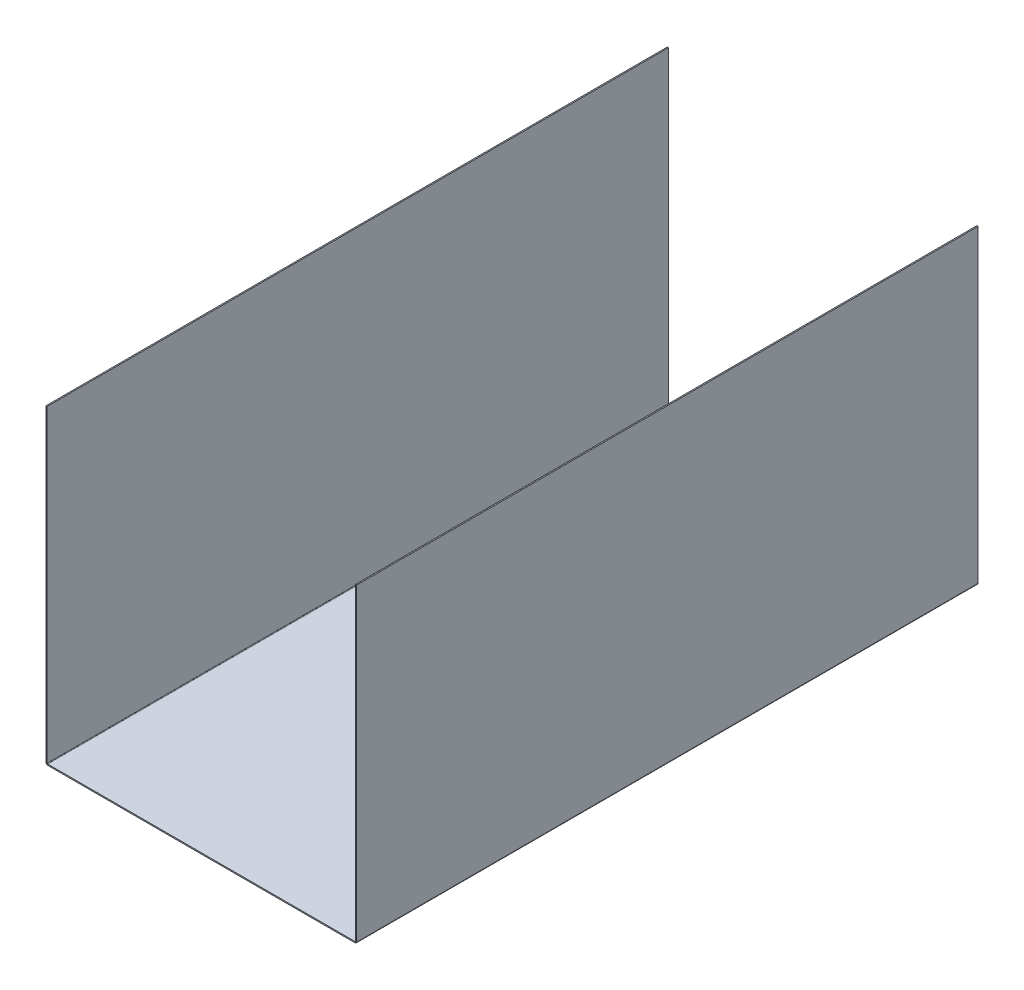
ISO-10303-21;
HEADER;
FILE_DESCRIPTION(('STEP AP214'),'2;1');
FILE_NAME('part.step','',(''),(''),'','','');
FILE_SCHEMA(('AUTOMOTIVE_DESIGN { 1 0 10303 214 1 1 1 1 }'));
ENDSEC;
DATA;
#1=APPLICATION_CONTEXT('core data for automotive mechanical design processes');
#2=APPLICATION_PROTOCOL_DEFINITION('international standard','automotive_design',2000,#1);
#3=PRODUCT_CONTEXT('',#1,'mechanical');
#4=PRODUCT('Part','Part','',(#3));
#5=PRODUCT_RELATED_PRODUCT_CATEGORY('part','',(#4));
#6=PRODUCT_DEFINITION_FORMATION('','',#4);
#7=PRODUCT_DEFINITION_CONTEXT('part definition',#1,'design');
#8=PRODUCT_DEFINITION('design','',#6,#7);
#9=PRODUCT_DEFINITION_SHAPE('','',#8);
#10=(LENGTH_UNIT() NAMED_UNIT(*) SI_UNIT(.MILLI.,.METRE.));
#11=(NAMED_UNIT(*) PLANE_ANGLE_UNIT() SI_UNIT($,.RADIAN.));
#12=(NAMED_UNIT(*) SI_UNIT($,.STERADIAN.) SOLID_ANGLE_UNIT());
#13=UNCERTAINTY_MEASURE_WITH_UNIT(LENGTH_MEASURE(1.E-05),#10,'distance_accuracy_value','');
#14=(GEOMETRIC_REPRESENTATION_CONTEXT(3) GLOBAL_UNCERTAINTY_ASSIGNED_CONTEXT((#13)) GLOBAL_UNIT_ASSIGNED_CONTEXT((#10,
#11,#12)) REPRESENTATION_CONTEXT('',''));
#15=CARTESIAN_POINT('',(0.,0.,0.));
#16=DIRECTION('',(0.,0.,1.));
#17=DIRECTION('',(1.,0.,0.));
#18=AXIS2_PLACEMENT_3D('',#15,#16,#17);
#19=CARTESIAN_POINT('',(197.8,0.,400.));
#20=DIRECTION('',(0.,0.,1.));
#21=DIRECTION('',(1.,0.,0.));
#22=AXIS2_PLACEMENT_3D('',#19,#20,#21);
#23=PLANE('',#22);
#24=DIRECTION('',(0.,1.,0.));
#25=VECTOR('',#24,1.);
#26=CARTESIAN_POINT('',(197.8,0.,400.));
#27=LINE('',#26,#25);
#28=CARTESIAN_POINT('',(197.8,0.,400.));
#29=VERTEX_POINT('',#28);
#30=CARTESIAN_POINT('',(197.8,1.50000000000007,400.));
#31=VERTEX_POINT('',#30);
#32=EDGE_CURVE('E11',#29,#31,#27,.T.);
#33=ORIENTED_EDGE('',*,*,#32,.F.);
#34=CARTESIAN_POINT('',(197.8,2.20000000000007,400.));
#35=DIRECTION('',(0.,0.,1.));
#36=DIRECTION('',(1.,0.,0.));
#37=AXIS2_PLACEMENT_3D('',#34,#35,#36);
#38=CIRCLE('',#37,2.2);
#39=CARTESIAN_POINT('',(200.,2.20000000000007,400.));
#40=VERTEX_POINT('',#39);
#41=EDGE_CURVE('E247',#40,#29,#38,.F.);
#42=ORIENTED_EDGE('',*,*,#41,.F.);
#43=DIRECTION('',(1.,0.,0.));
#44=VECTOR('',#43,1.);
#45=CARTESIAN_POINT('',(198.5,2.20000000000007,400.));
#46=LINE('',#45,#44);
#47=CARTESIAN_POINT('',(198.5,2.20000000000007,400.));
#48=VERTEX_POINT('',#47);
#49=EDGE_CURVE('E45',#48,#40,#46,.T.);
#50=ORIENTED_EDGE('',*,*,#49,.F.);
#51=CARTESIAN_POINT('',(197.8,2.20000000000007,400.));
#52=DIRECTION('',(0.,0.,1.));
#53=DIRECTION('',(1.,0.,0.));
#54=AXIS2_PLACEMENT_3D('',#51,#52,#53);
#55=CIRCLE('',#54,0.7);
#56=EDGE_CURVE('E146',#48,#31,#55,.F.);
#57=ORIENTED_EDGE('',*,*,#56,.T.);
#58=EDGE_LOOP('',(#33,#42,#50,#57));
#59=FACE_BOUND('',#58,.T.);
#60=ADVANCED_FACE('F37',(#59),#23,.T.);
#61=CARTESIAN_POINT('',(198.5,2.20000000000007,400.));
#62=DIRECTION('',(0.,0.,1.));
#63=DIRECTION('',(1.,0.,0.));
#64=AXIS2_PLACEMENT_3D('',#61,#62,#63);
#65=PLANE('',#64);
#66=DIRECTION('',(-1.,0.,0.));
#67=VECTOR('',#66,1.);
#68=CARTESIAN_POINT('',(-200.,0.,400.));
#69=LINE('',#68,#67);
#70=CARTESIAN_POINT('',(-197.8,0.,400.));
#71=VERTEX_POINT('',#70);
#72=EDGE_CURVE('E140',#29,#71,#69,.T.);
#73=ORIENTED_EDGE('',*,*,#72,.F.);
#74=ORIENTED_EDGE('',*,*,#32,.T.);
#75=DIRECTION('',(-1.,0.,0.));
#76=VECTOR('',#75,1.);
#77=CARTESIAN_POINT('',(-200.,1.5,400.));
#78=LINE('',#77,#76);
#79=CARTESIAN_POINT('',(-197.8,1.5,400.));
#80=VERTEX_POINT('',#79);
#81=EDGE_CURVE('E137',#31,#80,#78,.T.);
#82=ORIENTED_EDGE('',*,*,#81,.T.);
#83=DIRECTION('',(0.,-1.,0.));
#84=VECTOR('',#83,1.);
#85=CARTESIAN_POINT('',(-197.8,1.5,400.));
#86=LINE('',#85,#84);
#87=EDGE_CURVE('E228',#80,#71,#86,.T.);
#88=ORIENTED_EDGE('',*,*,#87,.T.);
#89=EDGE_LOOP('',(#73,#74,#82,#88));
#90=FACE_BOUND('',#89,.T.);
#91=ADVANCED_FACE('F135',(#90),#65,.T.);
#92=CARTESIAN_POINT('',(200.,2.20000000000007,-400.));
#93=DIRECTION('',(0.,0.,-1.));
#94=DIRECTION('',(-1.,0.,0.));
#95=AXIS2_PLACEMENT_3D('',#92,#93,#94);
#96=PLANE('',#95);
#97=DIRECTION('',(-1.,0.,0.));
#98=VECTOR('',#97,1.);
#99=CARTESIAN_POINT('',(200.,2.20000000000007,-400.));
#100=LINE('',#99,#98);
#101=CARTESIAN_POINT('',(200.,2.20000000000007,-400.));
#102=VERTEX_POINT('',#101);
#103=CARTESIAN_POINT('',(198.5,2.20000000000007,-400.));
#104=VERTEX_POINT('',#103);
#105=EDGE_CURVE('E233',#102,#104,#100,.T.);
#106=ORIENTED_EDGE('',*,*,#105,.F.);
#107=CARTESIAN_POINT('',(197.8,2.20000000000007,-400.));
#108=DIRECTION('',(0.,0.,1.));
#109=DIRECTION('',(1.,0.,0.));
#110=AXIS2_PLACEMENT_3D('',#107,#108,#109);
#111=CIRCLE('',#110,2.2);
#112=CARTESIAN_POINT('',(197.8,0.,-400.));
#113=VERTEX_POINT('',#112);
#114=EDGE_CURVE('E185',#102,#113,#111,.F.);
#115=ORIENTED_EDGE('',*,*,#114,.T.);
#116=DIRECTION('',(0.,-1.,0.));
#117=VECTOR('',#116,1.);
#118=CARTESIAN_POINT('',(197.8,1.50000000000007,-400.));
#119=LINE('',#118,#117);
#120=CARTESIAN_POINT('',(197.8,1.50000000000007,-400.));
#121=VERTEX_POINT('',#120);
#122=EDGE_CURVE('E231',#121,#113,#119,.T.);
#123=ORIENTED_EDGE('',*,*,#122,.F.);
#124=CARTESIAN_POINT('',(197.8,2.20000000000007,-400.));
#125=DIRECTION('',(0.,0.,1.));
#126=DIRECTION('',(1.,0.,0.));
#127=AXIS2_PLACEMENT_3D('',#124,#125,#126);
#128=CIRCLE('',#127,0.7);
#129=EDGE_CURVE('E158',#104,#121,#128,.F.);
#130=ORIENTED_EDGE('',*,*,#129,.F.);
#131=EDGE_LOOP('',(#106,#115,#123,#130));
#132=FACE_BOUND('',#131,.T.);
#133=ADVANCED_FACE('F285',(#132),#96,.T.);
#134=CARTESIAN_POINT('',(197.8,1.50000000000007,-400.));
#135=DIRECTION('',(0.,0.,-1.));
#136=DIRECTION('',(-1.,0.,0.));
#137=AXIS2_PLACEMENT_3D('',#134,#135,#136);
#138=PLANE('',#137);
#139=DIRECTION('',(0.,-1.,0.));
#140=VECTOR('',#139,1.);
#141=CARTESIAN_POINT('',(200.,0.,-400.));
#142=LINE('',#141,#140);
#143=CARTESIAN_POINT('',(200.,400.,-400.));
#144=VERTEX_POINT('',#143);
#145=EDGE_CURVE('E188',#144,#102,#142,.T.);
#146=ORIENTED_EDGE('',*,*,#145,.T.);
#147=ORIENTED_EDGE('',*,*,#105,.T.);
#148=DIRECTION('',(0.,-1.,0.));
#149=VECTOR('',#148,1.);
#150=CARTESIAN_POINT('',(198.5,0.,-400.));
#151=LINE('',#150,#149);
#152=CARTESIAN_POINT('',(198.5,400.,-400.));
#153=VERTEX_POINT('',#152);
#154=EDGE_CURVE('E194',#153,#104,#151,.T.);
#155=ORIENTED_EDGE('',*,*,#154,.F.);
#156=DIRECTION('',(1.,0.,0.));
#157=VECTOR('',#156,1.);
#158=CARTESIAN_POINT('',(198.5,400.,-400.));
#159=LINE('',#158,#157);
#160=EDGE_CURVE('E191',#153,#144,#159,.T.);
#161=ORIENTED_EDGE('',*,*,#160,.T.);
#162=EDGE_LOOP('',(#146,#147,#155,#161));
#163=FACE_BOUND('',#162,.T.);
#164=ADVANCED_FACE('F288',(#163),#138,.T.);
#165=CARTESIAN_POINT('',(-200.,2.2,400.));
#166=DIRECTION('',(0.,0.,1.));
#167=DIRECTION('',(1.,0.,0.));
#168=AXIS2_PLACEMENT_3D('',#165,#166,#167);
#169=PLANE('',#168);
#170=DIRECTION('',(1.,0.,0.));
#171=VECTOR('',#170,1.);
#172=CARTESIAN_POINT('',(-200.,2.2,400.));
#173=LINE('',#172,#171);
#174=CARTESIAN_POINT('',(-200.,2.2,400.));
#175=VERTEX_POINT('',#174);
#176=CARTESIAN_POINT('',(-198.5,2.2,400.));
#177=VERTEX_POINT('',#176);
#178=EDGE_CURVE('E53',#175,#177,#173,.T.);
#179=ORIENTED_EDGE('',*,*,#178,.F.);
#180=CARTESIAN_POINT('',(-197.8,2.2,400.));
#181=DIRECTION('',(0.,0.,1.));
#182=DIRECTION('',(1.,0.,0.));
#183=AXIS2_PLACEMENT_3D('',#180,#181,#182);
#184=CIRCLE('',#183,2.2);
#185=EDGE_CURVE('E257',#71,#175,#184,.F.);
#186=ORIENTED_EDGE('',*,*,#185,.F.);
#187=ORIENTED_EDGE('',*,*,#87,.F.);
#188=CARTESIAN_POINT('',(-197.8,2.2,400.));
#189=DIRECTION('',(0.,0.,1.));
#190=DIRECTION('',(1.,0.,0.));
#191=AXIS2_PLACEMENT_3D('',#188,#189,#190);
#192=CIRCLE('',#191,0.7);
#193=EDGE_CURVE('E166',#80,#177,#192,.F.);
#194=ORIENTED_EDGE('',*,*,#193,.T.);
#195=EDGE_LOOP('',(#179,#186,#187,#194));
#196=FACE_BOUND('',#195,.T.);
#197=ADVANCED_FACE('F280',(#196),#169,.T.);
#198=CARTESIAN_POINT('',(-197.8,1.5,400.));
#199=DIRECTION('',(0.,0.,1.));
#200=DIRECTION('',(1.,0.,0.));
#201=AXIS2_PLACEMENT_3D('',#198,#199,#200);
#202=PLANE('',#201);
#203=DIRECTION('',(0.,1.,0.));
#204=VECTOR('',#203,1.);
#205=CARTESIAN_POINT('',(-200.,0.,400.));
#206=LINE('',#205,#204);
#207=CARTESIAN_POINT('',(-200.,400.,400.));
#208=VERTEX_POINT('',#207);
#209=EDGE_CURVE('E260',#175,#208,#206,.T.);
#210=ORIENTED_EDGE('',*,*,#209,.F.);
#211=ORIENTED_EDGE('',*,*,#178,.T.);
#212=DIRECTION('',(0.,1.,0.));
#213=VECTOR('',#212,1.);
#214=CARTESIAN_POINT('',(-198.5,0.,400.));
#215=LINE('',#214,#213);
#216=CARTESIAN_POINT('',(-198.5,400.,400.));
#217=VERTEX_POINT('',#216);
#218=EDGE_CURVE('E107',#177,#217,#215,.T.);
#219=ORIENTED_EDGE('',*,*,#218,.T.);
#220=DIRECTION('',(1.,0.,0.));
#221=VECTOR('',#220,1.);
#222=CARTESIAN_POINT('',(-200.,400.,400.));
#223=LINE('',#222,#221);
#224=EDGE_CURVE('E263',#208,#217,#223,.T.);
#225=ORIENTED_EDGE('',*,*,#224,.F.);
#226=EDGE_LOOP('',(#210,#211,#219,#225));
#227=FACE_BOUND('',#226,.T.);
#228=ADVANCED_FACE('F269',(#227),#202,.T.);
#229=CARTESIAN_POINT('',(-197.8,0.,-400.));
#230=DIRECTION('',(0.,0.,-1.));
#231=DIRECTION('',(-1.,0.,0.));
#232=AXIS2_PLACEMENT_3D('',#229,#230,#231);
#233=PLANE('',#232);
#234=DIRECTION('',(0.,1.,0.));
#235=VECTOR('',#234,1.);
#236=CARTESIAN_POINT('',(-197.8,0.,-400.));
#237=LINE('',#236,#235);
#238=CARTESIAN_POINT('',(-197.8,0.,-400.));
#239=VERTEX_POINT('',#238);
#240=CARTESIAN_POINT('',(-197.8,1.5,-400.));
#241=VERTEX_POINT('',#240);
#242=EDGE_CURVE('E94',#239,#241,#237,.T.);
#243=ORIENTED_EDGE('',*,*,#242,.F.);
#244=CARTESIAN_POINT('',(-197.8,2.2,-400.));
#245=DIRECTION('',(0.,0.,1.));
#246=DIRECTION('',(1.,0.,0.));
#247=AXIS2_PLACEMENT_3D('',#244,#245,#246);
#248=CIRCLE('',#247,2.2);
#249=CARTESIAN_POINT('',(-200.,2.2,-400.));
#250=VERTEX_POINT('',#249);
#251=EDGE_CURVE('E181',#239,#250,#248,.F.);
#252=ORIENTED_EDGE('',*,*,#251,.T.);
#253=DIRECTION('',(-1.,0.,0.));
#254=VECTOR('',#253,1.);
#255=CARTESIAN_POINT('',(-198.5,2.2,-400.));
#256=LINE('',#255,#254);
#257=CARTESIAN_POINT('',(-198.5,2.2,-400.));
#258=VERTEX_POINT('',#257);
#259=EDGE_CURVE('E101',#258,#250,#256,.T.);
#260=ORIENTED_EDGE('',*,*,#259,.F.);
#261=CARTESIAN_POINT('',(-197.8,2.2,-400.));
#262=DIRECTION('',(0.,0.,1.));
#263=DIRECTION('',(1.,0.,0.));
#264=AXIS2_PLACEMENT_3D('',#261,#262,#263);
#265=CIRCLE('',#264,0.7);
#266=EDGE_CURVE('E200',#241,#258,#265,.F.);
#267=ORIENTED_EDGE('',*,*,#266,.F.);
#268=EDGE_LOOP('',(#243,#252,#260,#267));
#269=FACE_BOUND('',#268,.T.);
#270=ADVANCED_FACE('F317',(#269),#233,.T.);
#271=CARTESIAN_POINT('',(-198.5,2.2,-400.));
#272=DIRECTION('',(0.,0.,-1.));
#273=DIRECTION('',(-1.,0.,0.));
#274=AXIS2_PLACEMENT_3D('',#271,#272,#273);
#275=PLANE('',#274);
#276=DIRECTION('',(-1.,0.,0.));
#277=VECTOR('',#276,1.);
#278=CARTESIAN_POINT('',(-200.,0.,-400.));
#279=LINE('',#278,#277);
#280=EDGE_CURVE('E183',#113,#239,#279,.T.);
#281=ORIENTED_EDGE('',*,*,#280,.T.);
#282=ORIENTED_EDGE('',*,*,#242,.T.);
#283=DIRECTION('',(-1.,0.,0.));
#284=VECTOR('',#283,1.);
#285=CARTESIAN_POINT('',(-200.,1.5,-400.));
#286=LINE('',#285,#284);
#287=EDGE_CURVE('E198',#121,#241,#286,.T.);
#288=ORIENTED_EDGE('',*,*,#287,.F.);
#289=ORIENTED_EDGE('',*,*,#122,.T.);
#290=EDGE_LOOP('',(#281,#282,#288,#289));
#291=FACE_BOUND('',#290,.T.);
#292=ADVANCED_FACE('F320',(#291),#275,.T.);
#293=CARTESIAN_POINT('',(-198.5,0.,400.));
#294=DIRECTION('',(-1.,0.,0.));
#295=DIRECTION('',(0.,0.,1.));
#296=AXIS2_PLACEMENT_3D('',#293,#294,#295);
#297=PLANE('',#296);
#298=DIRECTION('',(0.,1.,0.));
#299=VECTOR('',#298,1.);
#300=CARTESIAN_POINT('',(-198.5,0.,-400.));
#301=LINE('',#300,#299);
#302=CARTESIAN_POINT('',(-198.5,400.,-400.));
#303=VERTEX_POINT('',#302);
#304=EDGE_CURVE('E172',#258,#303,#301,.T.);
#305=ORIENTED_EDGE('',*,*,#304,.T.);
#306=DIRECTION('',(0.,0.,-1.));
#307=VECTOR('',#306,1.);
#308=CARTESIAN_POINT('',(-198.5,400.,400.));
#309=LINE('',#308,#307);
#310=EDGE_CURVE('E224',#217,#303,#309,.T.);
#311=ORIENTED_EDGE('',*,*,#310,.F.);
#312=ORIENTED_EDGE('',*,*,#218,.F.);
#313=DIRECTION('',(0.,0.,-1.));
#314=VECTOR('',#313,1.);
#315=CARTESIAN_POINT('',(-198.5,2.2,400.));
#316=LINE('',#315,#314);
#317=EDGE_CURVE('E168',#177,#258,#316,.T.);
#318=ORIENTED_EDGE('',*,*,#317,.T.);
#319=EDGE_LOOP('',(#305,#311,#312,#318));
#320=FACE_BOUND('',#319,.T.);
#321=ADVANCED_FACE('F323',(#320),#297,.F.);
#322=CARTESIAN_POINT('',(-200.,400.,400.));
#323=DIRECTION('',(0.,1.,0.));
#324=DIRECTION('',(0.,0.,1.));
#325=AXIS2_PLACEMENT_3D('',#322,#323,#324);
#326=PLANE('',#325);
#327=DIRECTION('',(1.,0.,0.));
#328=VECTOR('',#327,1.);
#329=CARTESIAN_POINT('',(-200.,400.,-400.));
#330=LINE('',#329,#328);
#331=CARTESIAN_POINT('',(-200.,400.,-400.));
#332=VERTEX_POINT('',#331);
#333=EDGE_CURVE('E175',#332,#303,#330,.T.);
#334=ORIENTED_EDGE('',*,*,#333,.F.);
#335=DIRECTION('',(0.,0.,-1.));
#336=VECTOR('',#335,1.);
#337=CARTESIAN_POINT('',(-200.,400.,400.));
#338=LINE('',#337,#336);
#339=EDGE_CURVE('E222',#208,#332,#338,.T.);
#340=ORIENTED_EDGE('',*,*,#339,.F.);
#341=ORIENTED_EDGE('',*,*,#224,.T.);
#342=ORIENTED_EDGE('',*,*,#310,.T.);
#343=EDGE_LOOP('',(#334,#340,#341,#342));
#344=FACE_BOUND('',#343,.T.);
#345=ADVANCED_FACE('F268',(#344),#326,.T.);
#346=CARTESIAN_POINT('',(-200.,0.,400.));
#347=DIRECTION('',(-1.,0.,0.));
#348=DIRECTION('',(0.,0.,1.));
#349=AXIS2_PLACEMENT_3D('',#346,#347,#348);
#350=PLANE('',#349);
#351=DIRECTION('',(0.,1.,0.));
#352=VECTOR('',#351,1.);
#353=CARTESIAN_POINT('',(-200.,0.,-400.));
#354=LINE('',#353,#352);
#355=EDGE_CURVE('E178',#250,#332,#354,.T.);
#356=ORIENTED_EDGE('',*,*,#355,.F.);
#357=DIRECTION('',(0.,0.,-1.));
#358=VECTOR('',#357,1.);
#359=CARTESIAN_POINT('',(-200.,2.2,400.));
#360=LINE('',#359,#358);
#361=EDGE_CURVE('E219',#175,#250,#360,.T.);
#362=ORIENTED_EDGE('',*,*,#361,.F.);
#363=ORIENTED_EDGE('',*,*,#209,.T.);
#364=ORIENTED_EDGE('',*,*,#339,.T.);
#365=EDGE_LOOP('',(#356,#362,#363,#364));
#366=FACE_BOUND('',#365,.T.);
#367=ADVANCED_FACE('F273',(#366),#350,.T.);
#368=CARTESIAN_POINT('',(-197.8,2.2,400.));
#369=DIRECTION('',(0.,0.,-1.));
#370=DIRECTION('',(-1.,0.,0.));
#371=AXIS2_PLACEMENT_3D('',#368,#369,#370);
#372=CYLINDRICAL_SURFACE('',#371,2.2);
#373=ORIENTED_EDGE('',*,*,#251,.F.);
#374=DIRECTION('',(0.,0.,-1.));
#375=VECTOR('',#374,1.);
#376=CARTESIAN_POINT('',(-197.8,0.,400.));
#377=LINE('',#376,#375);
#378=EDGE_CURVE('E216',#71,#239,#377,.T.);
#379=ORIENTED_EDGE('',*,*,#378,.F.);
#380=ORIENTED_EDGE('',*,*,#185,.T.);
#381=ORIENTED_EDGE('',*,*,#361,.T.);
#382=EDGE_LOOP('',(#373,#379,#380,#381));
#383=FACE_BOUND('',#382,.T.);
#384=ADVANCED_FACE('F276',(#383),#372,.T.);
#385=CARTESIAN_POINT('',(-200.,0.,400.));
#386=DIRECTION('',(0.,-1.,0.));
#387=DIRECTION('',(1.,0.,0.));
#388=AXIS2_PLACEMENT_3D('',#385,#386,#387);
#389=PLANE('',#388);
#390=ORIENTED_EDGE('',*,*,#280,.F.);
#391=DIRECTION('',(0.,0.,-1.));
#392=VECTOR('',#391,1.);
#393=CARTESIAN_POINT('',(197.8,0.,400.));
#394=LINE('',#393,#392);
#395=EDGE_CURVE('E213',#29,#113,#394,.T.);
#396=ORIENTED_EDGE('',*,*,#395,.F.);
#397=ORIENTED_EDGE('',*,*,#72,.T.);
#398=ORIENTED_EDGE('',*,*,#378,.T.);
#399=EDGE_LOOP('',(#390,#396,#397,#398));
#400=FACE_BOUND('',#399,.T.);
#401=ADVANCED_FACE('F283',(#400),#389,.T.);
#402=CARTESIAN_POINT('',(197.8,2.20000000000007,400.));
#403=DIRECTION('',(0.,0.,-1.));
#404=DIRECTION('',(-1.,0.,0.));
#405=AXIS2_PLACEMENT_3D('',#402,#403,#404);
#406=CYLINDRICAL_SURFACE('',#405,2.2);
#407=ORIENTED_EDGE('',*,*,#114,.F.);
#408=DIRECTION('',(0.,0.,-1.));
#409=VECTOR('',#408,1.);
#410=CARTESIAN_POINT('',(200.,2.20000000000007,400.));
#411=LINE('',#410,#409);
#412=EDGE_CURVE('E210',#40,#102,#411,.T.);
#413=ORIENTED_EDGE('',*,*,#412,.F.);
#414=ORIENTED_EDGE('',*,*,#41,.T.);
#415=ORIENTED_EDGE('',*,*,#395,.T.);
#416=EDGE_LOOP('',(#407,#413,#414,#415));
#417=FACE_BOUND('',#416,.T.);
#418=ADVANCED_FACE('F246',(#417),#406,.T.);
#419=CARTESIAN_POINT('',(200.,0.,400.));
#420=DIRECTION('',(1.,0.,0.));
#421=DIRECTION('',(0.,1.,0.));
#422=AXIS2_PLACEMENT_3D('',#419,#420,#421);
#423=PLANE('',#422);
#424=ORIENTED_EDGE('',*,*,#145,.F.);
#425=DIRECTION('',(0.,0.,-1.));
#426=VECTOR('',#425,1.);
#427=CARTESIAN_POINT('',(200.,400.,400.));
#428=LINE('',#427,#426);
#429=CARTESIAN_POINT('',(200.,400.,400.));
#430=VERTEX_POINT('',#429);
#431=EDGE_CURVE('E208',#430,#144,#428,.T.);
#432=ORIENTED_EDGE('',*,*,#431,.F.);
#433=DIRECTION('',(0.,-1.,0.));
#434=VECTOR('',#433,1.);
#435=CARTESIAN_POINT('',(200.,0.,400.));
#436=LINE('',#435,#434);
#437=EDGE_CURVE('E240',#430,#40,#436,.T.);
#438=ORIENTED_EDGE('',*,*,#437,.T.);
#439=ORIENTED_EDGE('',*,*,#412,.T.);
#440=EDGE_LOOP('',(#424,#432,#438,#439));
#441=FACE_BOUND('',#440,.T.);
#442=ADVANCED_FACE('F251',(#441),#423,.T.);
#443=CARTESIAN_POINT('',(198.5,400.,400.));
#444=DIRECTION('',(0.,1.,0.));
#445=DIRECTION('',(0.,0.,1.));
#446=AXIS2_PLACEMENT_3D('',#443,#444,#445);
#447=PLANE('',#446);
#448=ORIENTED_EDGE('',*,*,#160,.F.);
#449=DIRECTION('',(0.,0.,-1.));
#450=VECTOR('',#449,1.);
#451=CARTESIAN_POINT('',(198.5,400.,400.));
#452=LINE('',#451,#450);
#453=CARTESIAN_POINT('',(198.5,400.,400.));
#454=VERTEX_POINT('',#453);
#455=EDGE_CURVE('E206',#454,#153,#452,.T.);
#456=ORIENTED_EDGE('',*,*,#455,.F.);
#457=DIRECTION('',(1.,0.,0.));
#458=VECTOR('',#457,1.);
#459=CARTESIAN_POINT('',(198.5,400.,400.));
#460=LINE('',#459,#458);
#461=EDGE_CURVE('E252',#454,#430,#460,.T.);
#462=ORIENTED_EDGE('',*,*,#461,.T.);
#463=ORIENTED_EDGE('',*,*,#431,.T.);
#464=EDGE_LOOP('',(#448,#456,#462,#463));
#465=FACE_BOUND('',#464,.T.);
#466=ADVANCED_FACE('F293',(#465),#447,.T.);
#467=CARTESIAN_POINT('',(198.5,0.,400.));
#468=DIRECTION('',(1.,0.,0.));
#469=DIRECTION('',(0.,1.,0.));
#470=AXIS2_PLACEMENT_3D('',#467,#468,#469);
#471=PLANE('',#470);
#472=ORIENTED_EDGE('',*,*,#154,.T.);
#473=DIRECTION('',(0.,0.,-1.));
#474=VECTOR('',#473,1.);
#475=CARTESIAN_POINT('',(198.5,2.20000000000007,400.));
#476=LINE('',#475,#474);
#477=EDGE_CURVE('E160',#48,#104,#476,.T.);
#478=ORIENTED_EDGE('',*,*,#477,.F.);
#479=DIRECTION('',(0.,-1.,0.));
#480=VECTOR('',#479,1.);
#481=CARTESIAN_POINT('',(198.5,0.,400.));
#482=LINE('',#481,#480);
#483=EDGE_CURVE('E151',#454,#48,#482,.T.);
#484=ORIENTED_EDGE('',*,*,#483,.F.);
#485=ORIENTED_EDGE('',*,*,#455,.T.);
#486=EDGE_LOOP('',(#472,#478,#484,#485));
#487=FACE_BOUND('',#486,.T.);
#488=ADVANCED_FACE('F291',(#487),#471,.F.);
#489=CARTESIAN_POINT('',(197.8,2.20000000000007,400.));
#490=DIRECTION('',(0.,0.,-1.));
#491=DIRECTION('',(-1.,0.,0.));
#492=AXIS2_PLACEMENT_3D('',#489,#490,#491);
#493=CYLINDRICAL_SURFACE('',#492,0.7);
#494=ORIENTED_EDGE('',*,*,#129,.T.);
#495=DIRECTION('',(0.,0.,-1.));
#496=VECTOR('',#495,1.);
#497=CARTESIAN_POINT('',(197.8,1.50000000000007,400.));
#498=LINE('',#497,#496);
#499=EDGE_CURVE('E155',#31,#121,#498,.T.);
#500=ORIENTED_EDGE('',*,*,#499,.F.);
#501=ORIENTED_EDGE('',*,*,#56,.F.);
#502=ORIENTED_EDGE('',*,*,#477,.T.);
#503=EDGE_LOOP('',(#494,#500,#501,#502));
#504=FACE_BOUND('',#503,.T.);
#505=ADVANCED_FACE('F156',(#504),#493,.F.);
#506=CARTESIAN_POINT('',(-200.,1.5,400.));
#507=DIRECTION('',(0.,-1.,0.));
#508=DIRECTION('',(1.,0.,0.));
#509=AXIS2_PLACEMENT_3D('',#506,#507,#508);
#510=PLANE('',#509);
#511=ORIENTED_EDGE('',*,*,#287,.T.);
#512=DIRECTION('',(0.,0.,-1.));
#513=VECTOR('',#512,1.);
#514=CARTESIAN_POINT('',(-197.8,1.5,400.));
#515=LINE('',#514,#513);
#516=EDGE_CURVE('E161',#80,#241,#515,.T.);
#517=ORIENTED_EDGE('',*,*,#516,.F.);
#518=ORIENTED_EDGE('',*,*,#81,.F.);
#519=ORIENTED_EDGE('',*,*,#499,.T.);
#520=EDGE_LOOP('',(#511,#517,#518,#519));
#521=FACE_BOUND('',#520,.T.);
#522=ADVANCED_FACE('F163',(#521),#510,.F.);
#523=CARTESIAN_POINT('',(-197.8,2.2,400.));
#524=DIRECTION('',(0.,0.,-1.));
#525=DIRECTION('',(-1.,0.,0.));
#526=AXIS2_PLACEMENT_3D('',#523,#524,#525);
#527=CYLINDRICAL_SURFACE('',#526,0.7);
#528=ORIENTED_EDGE('',*,*,#266,.T.);
#529=ORIENTED_EDGE('',*,*,#317,.F.);
#530=ORIENTED_EDGE('',*,*,#193,.F.);
#531=ORIENTED_EDGE('',*,*,#516,.T.);
#532=EDGE_LOOP('',(#528,#529,#530,#531));
#533=FACE_BOUND('',#532,.T.);
#534=ADVANCED_FACE('F375',(#533),#527,.F.);
#535=CARTESIAN_POINT('',(-197.8,2.2,400.));
#536=DIRECTION('',(0.,0.,1.));
#537=DIRECTION('',(1.,0.,0.));
#538=AXIS2_PLACEMENT_3D('',#535,#536,#537);
#539=PLANE('',#538);
#540=ORIENTED_EDGE('',*,*,#483,.T.);
#541=ORIENTED_EDGE('',*,*,#49,.T.);
#542=ORIENTED_EDGE('',*,*,#437,.F.);
#543=ORIENTED_EDGE('',*,*,#461,.F.);
#544=EDGE_LOOP('',(#540,#541,#542,#543));
#545=FACE_BOUND('',#544,.T.);
#546=ADVANCED_FACE('F237',(#545),#539,.T.);
#547=CARTESIAN_POINT('',(-197.8,2.2,-400.));
#548=DIRECTION('',(0.,0.,1.));
#549=DIRECTION('',(1.,0.,0.));
#550=AXIS2_PLACEMENT_3D('',#547,#548,#549);
#551=PLANE('',#550);
#552=ORIENTED_EDGE('',*,*,#304,.F.);
#553=ORIENTED_EDGE('',*,*,#259,.T.);
#554=ORIENTED_EDGE('',*,*,#355,.T.);
#555=ORIENTED_EDGE('',*,*,#333,.T.);
#556=EDGE_LOOP('',(#552,#553,#554,#555));
#557=FACE_BOUND('',#556,.T.);
#558=ADVANCED_FACE('F395',(#557),#551,.F.);
#559=CLOSED_SHELL('',(#60,#91,#133,#164,#197,#228,#270,#292,#321,#345,#367,#384,#401,#418,#442,
#466,#488,#505,#522,#534,#546,#558));
#560=MANIFOLD_SOLID_BREP('B2',#559);
#561=ADVANCED_BREP_SHAPE_REPRESENTATION('',(#18,#560),#14);
#562=SHAPE_DEFINITION_REPRESENTATION(#9,#561);
ENDSEC;
END-ISO-10303-21;
